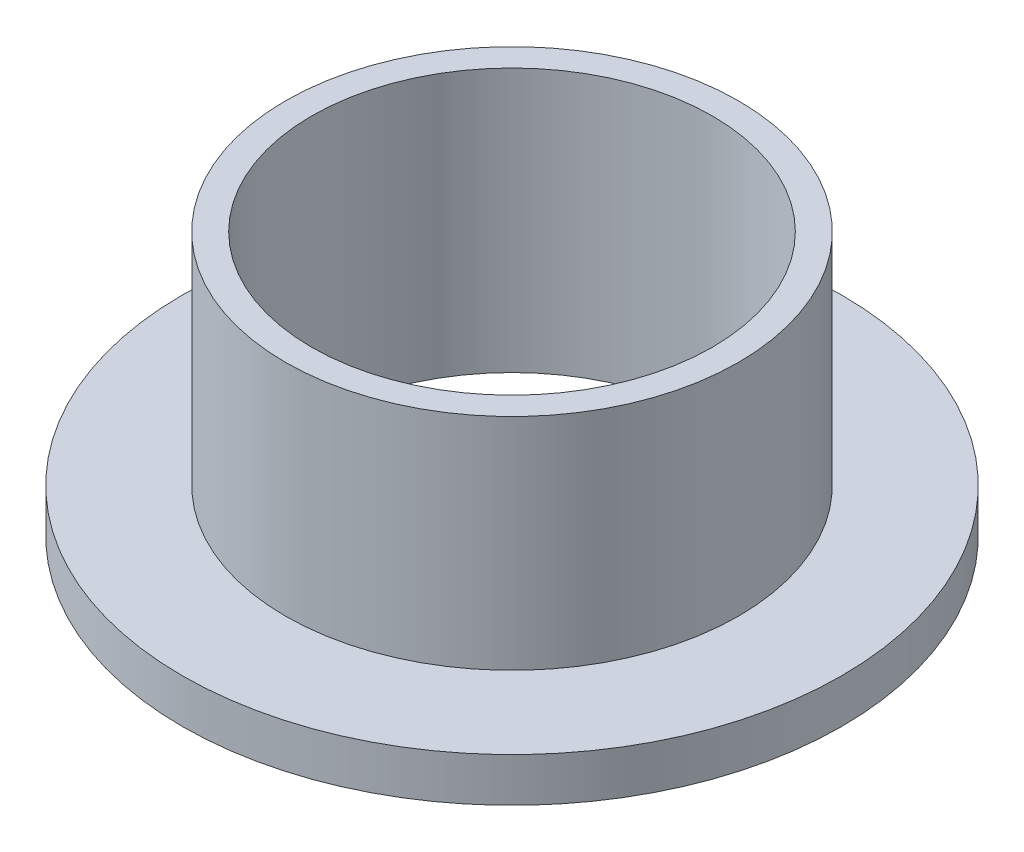
ISO-10303-21;
HEADER;
FILE_DESCRIPTION(('STEP AP214'),'2;1');
FILE_NAME('part.step','',(''),(''),'','','');
FILE_SCHEMA(('AUTOMOTIVE_DESIGN { 1 0 10303 214 1 1 1 1 }'));
ENDSEC;
DATA;
#1=APPLICATION_CONTEXT('core data for automotive mechanical design processes');
#2=APPLICATION_PROTOCOL_DEFINITION('international standard','automotive_design',2000,#1);
#3=PRODUCT_CONTEXT('',#1,'mechanical');
#4=PRODUCT('Part','Part','',(#3));
#5=PRODUCT_RELATED_PRODUCT_CATEGORY('part','',(#4));
#6=PRODUCT_DEFINITION_FORMATION('','',#4);
#7=PRODUCT_DEFINITION_CONTEXT('part definition',#1,'design');
#8=PRODUCT_DEFINITION('design','',#6,#7);
#9=PRODUCT_DEFINITION_SHAPE('','',#8);
#10=(LENGTH_UNIT() NAMED_UNIT(*) SI_UNIT(.MILLI.,.METRE.));
#11=(NAMED_UNIT(*) PLANE_ANGLE_UNIT() SI_UNIT($,.RADIAN.));
#12=(NAMED_UNIT(*) SI_UNIT($,.STERADIAN.) SOLID_ANGLE_UNIT());
#13=UNCERTAINTY_MEASURE_WITH_UNIT(LENGTH_MEASURE(1.E-05),#10,'distance_accuracy_value','');
#14=(GEOMETRIC_REPRESENTATION_CONTEXT(3) GLOBAL_UNCERTAINTY_ASSIGNED_CONTEXT((#13)) GLOBAL_UNIT_ASSIGNED_CONTEXT((#10,
#11,#12)) REPRESENTATION_CONTEXT('',''));
#15=CARTESIAN_POINT('',(0.,0.,0.));
#16=DIRECTION('',(0.,0.,1.));
#17=DIRECTION('',(1.,0.,0.));
#18=AXIS2_PLACEMENT_3D('',#15,#16,#17);
#19=CARTESIAN_POINT('',(0.,4.,0.));
#20=DIRECTION('',(0.,-1.,0.));
#21=DIRECTION('',(0.,0.,-1.));
#22=AXIS2_PLACEMENT_3D('',#19,#20,#21);
#23=CYLINDRICAL_SURFACE('',#22,30.);
#24=CARTESIAN_POINT('',(0.,4.,0.));
#25=DIRECTION('',(0.,1.,0.));
#26=DIRECTION('',(0.,0.,1.));
#27=AXIS2_PLACEMENT_3D('',#24,#25,#26);
#28=CIRCLE('',#27,30.);
#29=CARTESIAN_POINT('',(0.,4.,30.));
#30=VERTEX_POINT('',#29);
#31=EDGE_CURVE('E10',#30,#30,#28,.T.);
#32=ORIENTED_EDGE('',*,*,#31,.F.);
#33=EDGE_LOOP('',(#32));
#34=FACE_BOUND('',#33,.T.);
#35=CARTESIAN_POINT('',(0.,0.,0.));
#36=DIRECTION('',(0.,1.,0.));
#37=DIRECTION('',(0.,0.,1.));
#38=AXIS2_PLACEMENT_3D('',#35,#36,#37);
#39=CIRCLE('',#38,30.);
#40=CARTESIAN_POINT('',(0.,0.,30.));
#41=VERTEX_POINT('',#40);
#42=EDGE_CURVE('E46',#41,#41,#39,.T.);
#43=ORIENTED_EDGE('',*,*,#42,.T.);
#44=EDGE_LOOP('',(#43));
#45=FACE_BOUND('',#44,.T.);
#46=ADVANCED_FACE('F43',(#34,#45),#23,.T.);
#47=CARTESIAN_POINT('',(0.,4.,0.));
#48=DIRECTION('',(0.,1.,0.));
#49=DIRECTION('',(0.,0.,1.));
#50=AXIS2_PLACEMENT_3D('',#47,#48,#49);
#51=PLANE('',#50);
#52=CARTESIAN_POINT('',(0.,4.,0.));
#53=DIRECTION('',(0.,1.,0.));
#54=DIRECTION('',(0.,0.,1.));
#55=AXIS2_PLACEMENT_3D('',#52,#53,#54);
#56=CIRCLE('',#55,20.6107041715871);
#57=CARTESIAN_POINT('',(0.,4.,20.6107041715871));
#58=VERTEX_POINT('',#57);
#59=EDGE_CURVE('E55',#58,#58,#56,.F.);
#60=ORIENTED_EDGE('',*,*,#59,.T.);
#61=EDGE_LOOP('',(#60));
#62=FACE_BOUND('',#61,.T.);
#63=ORIENTED_EDGE('',*,*,#31,.T.);
#64=EDGE_LOOP('',(#63));
#65=FACE_BOUND('',#64,.T.);
#66=ADVANCED_FACE('F91',(#62,#65),#51,.T.);
#67=CARTESIAN_POINT('',(0.,0.,0.));
#68=DIRECTION('',(0.,1.,0.));
#69=DIRECTION('',(0.,0.,1.));
#70=AXIS2_PLACEMENT_3D('',#67,#68,#69);
#71=PLANE('',#70);
#72=CARTESIAN_POINT('',(0.,0.,0.));
#73=DIRECTION('',(0.,1.,0.));
#74=DIRECTION('',(0.,0.,1.));
#75=AXIS2_PLACEMENT_3D('',#72,#73,#74);
#76=CIRCLE('',#75,18.2318359235117);
#77=CARTESIAN_POINT('',(0.,0.,18.2318359235117));
#78=VERTEX_POINT('',#77);
#79=EDGE_CURVE('E65',#78,#78,#76,.T.);
#80=ORIENTED_EDGE('',*,*,#79,.T.);
#81=EDGE_LOOP('',(#80));
#82=FACE_BOUND('',#81,.T.);
#83=ORIENTED_EDGE('',*,*,#42,.F.);
#84=EDGE_LOOP('',(#83));
#85=FACE_BOUND('',#84,.T.);
#86=ADVANCED_FACE('F84',(#82,#85),#71,.F.);
#87=CARTESIAN_POINT('',(0.,24.,0.));
#88=DIRECTION('',(0.,-1.,0.));
#89=DIRECTION('',(0.,0.,-1.));
#90=AXIS2_PLACEMENT_3D('',#87,#88,#89);
#91=CYLINDRICAL_SURFACE('',#90,20.6107041715871);
#92=ORIENTED_EDGE('',*,*,#59,.F.);
#93=EDGE_LOOP('',(#92));
#94=FACE_BOUND('',#93,.T.);
#95=CARTESIAN_POINT('',(0.,24.,0.));
#96=DIRECTION('',(0.,1.,0.));
#97=DIRECTION('',(0.,0.,1.));
#98=AXIS2_PLACEMENT_3D('',#95,#96,#97);
#99=CIRCLE('',#98,20.6107041715871);
#100=CARTESIAN_POINT('',(0.,24.,20.6107041715871));
#101=VERTEX_POINT('',#100);
#102=EDGE_CURVE('E60',#101,#101,#99,.T.);
#103=ORIENTED_EDGE('',*,*,#102,.F.);
#104=EDGE_LOOP('',(#103));
#105=FACE_BOUND('',#104,.T.);
#106=ADVANCED_FACE('F79',(#94,#105),#91,.T.);
#107=CARTESIAN_POINT('',(0.,24.,0.));
#108=DIRECTION('',(0.,1.,0.));
#109=DIRECTION('',(0.,0.,1.));
#110=AXIS2_PLACEMENT_3D('',#107,#108,#109);
#111=PLANE('',#110);
#112=CARTESIAN_POINT('',(0.,24.,0.));
#113=DIRECTION('',(0.,1.,0.));
#114=DIRECTION('',(0.,0.,1.));
#115=AXIS2_PLACEMENT_3D('',#112,#113,#114);
#116=CIRCLE('',#115,18.2318359235117);
#117=CARTESIAN_POINT('',(0.,24.,18.2318359235117));
#118=VERTEX_POINT('',#117);
#119=EDGE_CURVE('E64',#118,#118,#116,.T.);
#120=ORIENTED_EDGE('',*,*,#119,.F.);
#121=EDGE_LOOP('',(#120));
#122=FACE_BOUND('',#121,.T.);
#123=ORIENTED_EDGE('',*,*,#102,.T.);
#124=EDGE_LOOP('',(#123));
#125=FACE_BOUND('',#124,.T.);
#126=ADVANCED_FACE('F76',(#122,#125),#111,.T.);
#127=CARTESIAN_POINT('',(0.,24.,0.));
#128=DIRECTION('',(0.,-1.,0.));
#129=DIRECTION('',(0.,0.,-1.));
#130=AXIS2_PLACEMENT_3D('',#127,#128,#129);
#131=CYLINDRICAL_SURFACE('',#130,18.2318359235117);
#132=ORIENTED_EDGE('',*,*,#119,.T.);
#133=EDGE_LOOP('',(#132));
#134=FACE_BOUND('',#133,.T.);
#135=ORIENTED_EDGE('',*,*,#79,.F.);
#136=EDGE_LOOP('',(#135));
#137=FACE_BOUND('',#136,.T.);
#138=ADVANCED_FACE('F73',(#134,#137),#131,.F.);
#139=CLOSED_SHELL('',(#46,#66,#86,#106,#126,#138));
#140=MANIFOLD_SOLID_BREP('B2',#139);
#141=ADVANCED_BREP_SHAPE_REPRESENTATION('',(#18,#140),#14);
#142=SHAPE_DEFINITION_REPRESENTATION(#9,#141);
ENDSEC;
END-ISO-10303-21;
